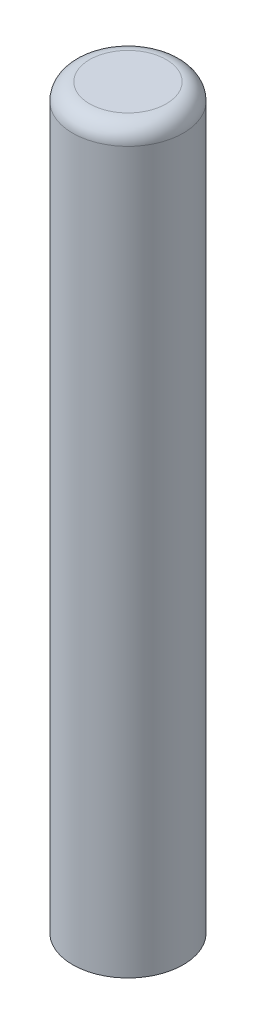
ISO-10303-21;
HEADER;
FILE_DESCRIPTION(('STEP AP214'),'2;1');
FILE_NAME('part.step','',(''),(''),'','','');
FILE_SCHEMA(('AUTOMOTIVE_DESIGN { 1 0 10303 214 1 1 1 1 }'));
ENDSEC;
DATA;
#1=APPLICATION_CONTEXT('core data for automotive mechanical design processes');
#2=APPLICATION_PROTOCOL_DEFINITION('international standard','automotive_design',2000,#1);
#3=PRODUCT_CONTEXT('',#1,'mechanical');
#4=PRODUCT('Part','Part','',(#3));
#5=PRODUCT_RELATED_PRODUCT_CATEGORY('part','',(#4));
#6=PRODUCT_DEFINITION_FORMATION('','',#4);
#7=PRODUCT_DEFINITION_CONTEXT('part definition',#1,'design');
#8=PRODUCT_DEFINITION('design','',#6,#7);
#9=PRODUCT_DEFINITION_SHAPE('','',#8);
#10=(LENGTH_UNIT() NAMED_UNIT(*) SI_UNIT(.MILLI.,.METRE.));
#11=(NAMED_UNIT(*) PLANE_ANGLE_UNIT() SI_UNIT($,.RADIAN.));
#12=(NAMED_UNIT(*) SI_UNIT($,.STERADIAN.) SOLID_ANGLE_UNIT());
#13=UNCERTAINTY_MEASURE_WITH_UNIT(LENGTH_MEASURE(1.E-05),#10,'distance_accuracy_value','');
#14=(GEOMETRIC_REPRESENTATION_CONTEXT(3) GLOBAL_UNCERTAINTY_ASSIGNED_CONTEXT((#13)) GLOBAL_UNIT_ASSIGNED_CONTEXT((#10,
#11,#12)) REPRESENTATION_CONTEXT('',''));
#15=CARTESIAN_POINT('',(0.,0.,0.));
#16=DIRECTION('',(0.,0.,1.));
#17=DIRECTION('',(1.,0.,0.));
#18=AXIS2_PLACEMENT_3D('',#15,#16,#17);
#19=CARTESIAN_POINT('',(0.,100.,0.));
#20=DIRECTION('',(0.,-1.,0.));
#21=DIRECTION('',(0.,0.,-1.));
#22=AXIS2_PLACEMENT_3D('',#19,#20,#21);
#23=CYLINDRICAL_SURFACE('',#22,7.5);
#24=CARTESIAN_POINT('',(0.,97.7,0.));
#25=DIRECTION('',(0.,1.,0.));
#26=DIRECTION('',(0.,0.,1.));
#27=AXIS2_PLACEMENT_3D('',#24,#25,#26);
#28=CIRCLE('',#27,7.5);
#29=CARTESIAN_POINT('',(0.,97.7,7.5));
#30=VERTEX_POINT('',#29);
#31=EDGE_CURVE('E10',#30,#30,#28,.F.);
#32=ORIENTED_EDGE('',*,*,#31,.T.);
#33=EDGE_LOOP('',(#32));
#34=FACE_BOUND('',#33,.T.);
#35=CARTESIAN_POINT('',(0.,0.,0.));
#36=DIRECTION('',(0.,1.,0.));
#37=DIRECTION('',(0.,0.,1.));
#38=AXIS2_PLACEMENT_3D('',#35,#36,#37);
#39=CIRCLE('',#38,7.5);
#40=CARTESIAN_POINT('',(0.,0.,7.5));
#41=VERTEX_POINT('',#40);
#42=EDGE_CURVE('E42',#41,#41,#39,.T.);
#43=ORIENTED_EDGE('',*,*,#42,.T.);
#44=EDGE_LOOP('',(#43));
#45=FACE_BOUND('',#44,.T.);
#46=ADVANCED_FACE('F31',(#34,#45),#23,.T.);
#47=CARTESIAN_POINT('',(0.,100.,0.));
#48=DIRECTION('',(0.,1.,0.));
#49=DIRECTION('',(0.,0.,1.));
#50=AXIS2_PLACEMENT_3D('',#47,#48,#49);
#51=PLANE('',#50);
#52=CARTESIAN_POINT('',(0.,100.,0.));
#53=DIRECTION('',(0.,1.,0.));
#54=DIRECTION('',(0.,0.,1.));
#55=AXIS2_PLACEMENT_3D('',#52,#53,#54);
#56=CIRCLE('',#55,5.2);
#57=CARTESIAN_POINT('',(0.,100.,5.2));
#58=VERTEX_POINT('',#57);
#59=EDGE_CURVE('E38',#58,#58,#56,.T.);
#60=ORIENTED_EDGE('',*,*,#59,.T.);
#61=EDGE_LOOP('',(#60));
#62=FACE_BOUND('',#61,.T.);
#63=ADVANCED_FACE('F52',(#62),#51,.T.);
#64=CARTESIAN_POINT('',(0.,0.,0.));
#65=DIRECTION('',(0.,1.,0.));
#66=DIRECTION('',(0.,0.,1.));
#67=AXIS2_PLACEMENT_3D('',#64,#65,#66);
#68=PLANE('',#67);
#69=ORIENTED_EDGE('',*,*,#42,.F.);
#70=EDGE_LOOP('',(#69));
#71=FACE_BOUND('',#70,.T.);
#72=ADVANCED_FACE('F50',(#71),#68,.F.);
#73=CARTESIAN_POINT('',(0.,97.7,0.));
#74=DIRECTION('',(0.,1.,0.));
#75=DIRECTION('',(0.,0.,1.));
#76=AXIS2_PLACEMENT_3D('',#73,#74,#75);
#77=TOROIDAL_SURFACE('',#76,5.2,2.3);
#78=ORIENTED_EDGE('',*,*,#31,.F.);
#79=EDGE_LOOP('',(#78));
#80=FACE_BOUND('',#79,.T.);
#81=ORIENTED_EDGE('',*,*,#59,.F.);
#82=EDGE_LOOP('',(#81));
#83=FACE_BOUND('',#82,.T.);
#84=ADVANCED_FACE('F33',(#80,#83),#77,.T.);
#85=CLOSED_SHELL('',(#46,#63,#72,#84));
#86=MANIFOLD_SOLID_BREP('B2',#85);
#87=ADVANCED_BREP_SHAPE_REPRESENTATION('',(#18,#86),#14);
#88=SHAPE_DEFINITION_REPRESENTATION(#9,#87);
ENDSEC;
END-ISO-10303-21;
